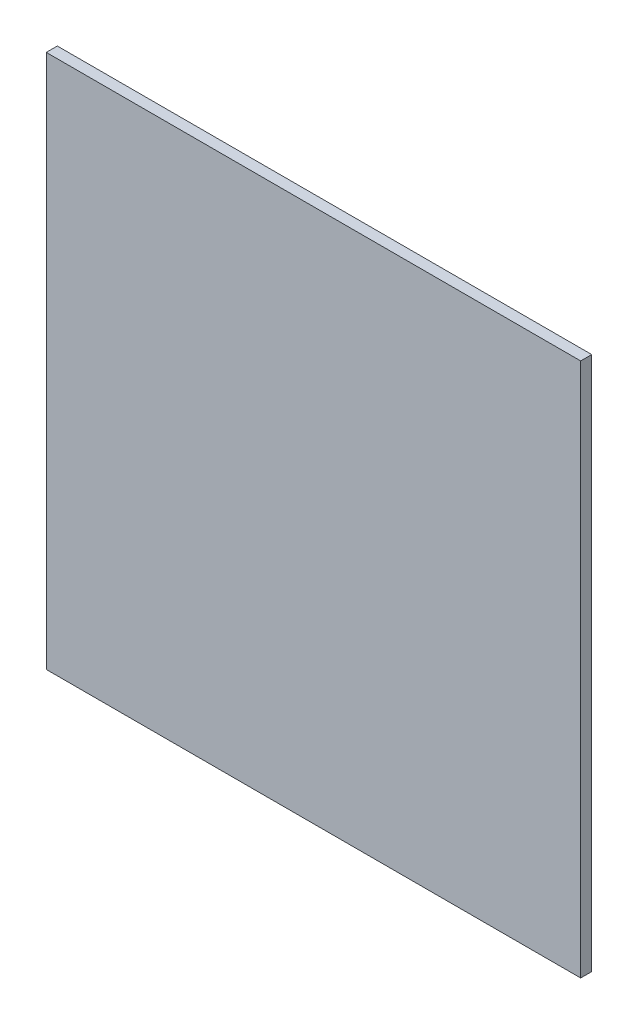
ISO-10303-21;
HEADER;
FILE_DESCRIPTION(('STEP AP214'),'2;1');
FILE_NAME('part.step','',(''),(''),'','','');
FILE_SCHEMA(('AUTOMOTIVE_DESIGN { 1 0 10303 214 1 1 1 1 }'));
ENDSEC;
DATA;
#1=APPLICATION_CONTEXT('core data for automotive mechanical design processes');
#2=APPLICATION_PROTOCOL_DEFINITION('international standard','automotive_design',2000,#1);
#3=PRODUCT_CONTEXT('',#1,'mechanical');
#4=PRODUCT('Part','Part','',(#3));
#5=PRODUCT_RELATED_PRODUCT_CATEGORY('part','',(#4));
#6=PRODUCT_DEFINITION_FORMATION('','',#4);
#7=PRODUCT_DEFINITION_CONTEXT('part definition',#1,'design');
#8=PRODUCT_DEFINITION('design','',#6,#7);
#9=PRODUCT_DEFINITION_SHAPE('','',#8);
#10=(LENGTH_UNIT() NAMED_UNIT(*) SI_UNIT(.MILLI.,.METRE.));
#11=(NAMED_UNIT(*) PLANE_ANGLE_UNIT() SI_UNIT($,.RADIAN.));
#12=(NAMED_UNIT(*) SI_UNIT($,.STERADIAN.) SOLID_ANGLE_UNIT());
#13=UNCERTAINTY_MEASURE_WITH_UNIT(LENGTH_MEASURE(1.E-05),#10,'distance_accuracy_value','');
#14=(GEOMETRIC_REPRESENTATION_CONTEXT(3) GLOBAL_UNCERTAINTY_ASSIGNED_CONTEXT((#13)) GLOBAL_UNIT_ASSIGNED_CONTEXT((#10,
#11,#12)) REPRESENTATION_CONTEXT('',''));
#15=CARTESIAN_POINT('',(0.,0.,0.));
#16=DIRECTION('',(0.,0.,1.));
#17=DIRECTION('',(1.,0.,0.));
#18=AXIS2_PLACEMENT_3D('',#15,#16,#17);
#19=CARTESIAN_POINT('',(72.5,-72.5,3.));
#20=DIRECTION('',(-1.,0.,0.));
#21=DIRECTION('',(0.,0.,1.));
#22=AXIS2_PLACEMENT_3D('',#19,#20,#21);
#23=PLANE('',#22);
#24=DIRECTION('',(0.,1.,0.));
#25=VECTOR('',#24,1.);
#26=CARTESIAN_POINT('',(72.5,-72.5,0.));
#27=LINE('',#26,#25);
#28=CARTESIAN_POINT('',(72.5,-72.5,0.));
#29=VERTEX_POINT('',#28);
#30=CARTESIAN_POINT('',(72.5,72.5,0.));
#31=VERTEX_POINT('',#30);
#32=EDGE_CURVE('E114',#29,#31,#27,.T.);
#33=ORIENTED_EDGE('',*,*,#32,.T.);
#34=DIRECTION('',(0.,0.,-1.));
#35=VECTOR('',#34,1.);
#36=CARTESIAN_POINT('',(72.5,72.5,3.));
#37=LINE('',#36,#35);
#38=CARTESIAN_POINT('',(72.5,72.5,3.));
#39=VERTEX_POINT('',#38);
#40=EDGE_CURVE('E11',#39,#31,#37,.T.);
#41=ORIENTED_EDGE('',*,*,#40,.F.);
#42=DIRECTION('',(0.,1.,0.));
#43=VECTOR('',#42,1.);
#44=CARTESIAN_POINT('',(72.5,-72.5,3.));
#45=LINE('',#44,#43);
#46=CARTESIAN_POINT('',(72.5,-72.5,3.));
#47=VERTEX_POINT('',#46);
#48=EDGE_CURVE('E100',#47,#39,#45,.T.);
#49=ORIENTED_EDGE('',*,*,#48,.F.);
#50=DIRECTION('',(0.,0.,-1.));
#51=VECTOR('',#50,1.);
#52=CARTESIAN_POINT('',(72.5,-72.5,3.));
#53=LINE('',#52,#51);
#54=EDGE_CURVE('E108',#47,#29,#53,.T.);
#55=ORIENTED_EDGE('',*,*,#54,.T.);
#56=EDGE_LOOP('',(#33,#41,#49,#55));
#57=FACE_BOUND('',#56,.T.);
#58=ADVANCED_FACE('F44',(#57),#23,.F.);
#59=CARTESIAN_POINT('',(-72.5,72.5,3.));
#60=DIRECTION('',(0.,-1.,0.));
#61=DIRECTION('',(0.,0.,-1.));
#62=AXIS2_PLACEMENT_3D('',#59,#60,#61);
#63=PLANE('',#62);
#64=DIRECTION('',(-1.,0.,0.));
#65=VECTOR('',#64,1.);
#66=CARTESIAN_POINT('',(-72.5,72.5,0.));
#67=LINE('',#66,#65);
#68=CARTESIAN_POINT('',(-72.5,72.5,0.));
#69=VERTEX_POINT('',#68);
#70=EDGE_CURVE('E105',#31,#69,#67,.T.);
#71=ORIENTED_EDGE('',*,*,#70,.T.);
#72=DIRECTION('',(0.,0.,-1.));
#73=VECTOR('',#72,1.);
#74=CARTESIAN_POINT('',(-72.5,72.5,3.));
#75=LINE('',#74,#73);
#76=CARTESIAN_POINT('',(-72.5,72.5,3.));
#77=VERTEX_POINT('',#76);
#78=EDGE_CURVE('E53',#77,#69,#75,.T.);
#79=ORIENTED_EDGE('',*,*,#78,.F.);
#80=DIRECTION('',(-1.,0.,0.));
#81=VECTOR('',#80,1.);
#82=CARTESIAN_POINT('',(-72.5,72.5,3.));
#83=LINE('',#82,#81);
#84=EDGE_CURVE('E95',#39,#77,#83,.T.);
#85=ORIENTED_EDGE('',*,*,#84,.F.);
#86=ORIENTED_EDGE('',*,*,#40,.T.);
#87=EDGE_LOOP('',(#71,#79,#85,#86));
#88=FACE_BOUND('',#87,.T.);
#89=ADVANCED_FACE('F101',(#88),#63,.F.);
#90=CARTESIAN_POINT('',(-72.5,-72.5,3.));
#91=DIRECTION('',(1.,0.,0.));
#92=DIRECTION('',(0.,0.,-1.));
#93=AXIS2_PLACEMENT_3D('',#90,#91,#92);
#94=PLANE('',#93);
#95=DIRECTION('',(0.,-1.,0.));
#96=VECTOR('',#95,1.);
#97=CARTESIAN_POINT('',(-72.5,-72.5,0.));
#98=LINE('',#97,#96);
#99=CARTESIAN_POINT('',(-72.5,-72.5,0.));
#100=VERTEX_POINT('',#99);
#101=EDGE_CURVE('E76',#69,#100,#98,.T.);
#102=ORIENTED_EDGE('',*,*,#101,.T.);
#103=DIRECTION('',(0.,0.,-1.));
#104=VECTOR('',#103,1.);
#105=CARTESIAN_POINT('',(-72.5,-72.5,3.));
#106=LINE('',#105,#104);
#107=CARTESIAN_POINT('',(-72.5,-72.5,3.));
#108=VERTEX_POINT('',#107);
#109=EDGE_CURVE('E102',#108,#100,#106,.T.);
#110=ORIENTED_EDGE('',*,*,#109,.F.);
#111=DIRECTION('',(0.,-1.,0.));
#112=VECTOR('',#111,1.);
#113=CARTESIAN_POINT('',(-72.5,-72.5,3.));
#114=LINE('',#113,#112);
#115=EDGE_CURVE('E92',#77,#108,#114,.T.);
#116=ORIENTED_EDGE('',*,*,#115,.F.);
#117=ORIENTED_EDGE('',*,*,#78,.T.);
#118=EDGE_LOOP('',(#102,#110,#116,#117));
#119=FACE_BOUND('',#118,.T.);
#120=ADVANCED_FACE('F104',(#119),#94,.F.);
#121=CARTESIAN_POINT('',(-72.5,-72.5,3.));
#122=DIRECTION('',(0.,1.,0.));
#123=DIRECTION('',(0.,0.,1.));
#124=AXIS2_PLACEMENT_3D('',#121,#122,#123);
#125=PLANE('',#124);
#126=DIRECTION('',(1.,0.,0.));
#127=VECTOR('',#126,1.);
#128=CARTESIAN_POINT('',(-72.5,-72.5,0.));
#129=LINE('',#128,#127);
#130=EDGE_CURVE('E81',#100,#29,#129,.T.);
#131=ORIENTED_EDGE('',*,*,#130,.T.);
#132=ORIENTED_EDGE('',*,*,#54,.F.);
#133=DIRECTION('',(1.,0.,0.));
#134=VECTOR('',#133,1.);
#135=CARTESIAN_POINT('',(-72.5,-72.5,3.));
#136=LINE('',#135,#134);
#137=EDGE_CURVE('E64',#108,#47,#136,.T.);
#138=ORIENTED_EDGE('',*,*,#137,.F.);
#139=ORIENTED_EDGE('',*,*,#109,.T.);
#140=EDGE_LOOP('',(#131,#132,#138,#139));
#141=FACE_BOUND('',#140,.T.);
#142=ADVANCED_FACE('F127',(#141),#125,.F.);
#143=CARTESIAN_POINT('',(0.,0.,3.));
#144=DIRECTION('',(0.,0.,-1.));
#145=DIRECTION('',(-1.,0.,0.));
#146=AXIS2_PLACEMENT_3D('',#143,#144,#145);
#147=PLANE('',#146);
#148=ORIENTED_EDGE('',*,*,#48,.T.);
#149=ORIENTED_EDGE('',*,*,#84,.T.);
#150=ORIENTED_EDGE('',*,*,#115,.T.);
#151=ORIENTED_EDGE('',*,*,#137,.T.);
#152=EDGE_LOOP('',(#148,#149,#150,#151));
#153=FACE_BOUND('',#152,.T.);
#154=ADVANCED_FACE('F91',(#153),#147,.F.);
#155=CARTESIAN_POINT('',(0.,0.,0.));
#156=DIRECTION('',(0.,0.,-1.));
#157=DIRECTION('',(-1.,0.,0.));
#158=AXIS2_PLACEMENT_3D('',#155,#156,#157);
#159=PLANE('',#158);
#160=ORIENTED_EDGE('',*,*,#32,.F.);
#161=ORIENTED_EDGE('',*,*,#130,.F.);
#162=ORIENTED_EDGE('',*,*,#101,.F.);
#163=ORIENTED_EDGE('',*,*,#70,.F.);
#164=EDGE_LOOP('',(#160,#161,#162,#163));
#165=FACE_BOUND('',#164,.T.);
#166=ADVANCED_FACE('F129',(#165),#159,.T.);
#167=CLOSED_SHELL('',(#58,#89,#120,#142,#154,#166));
#168=MANIFOLD_SOLID_BREP('B2',#167);
#169=ADVANCED_BREP_SHAPE_REPRESENTATION('',(#18,#168),#14);
#170=SHAPE_DEFINITION_REPRESENTATION(#9,#169);
ENDSEC;
END-ISO-10303-21;
